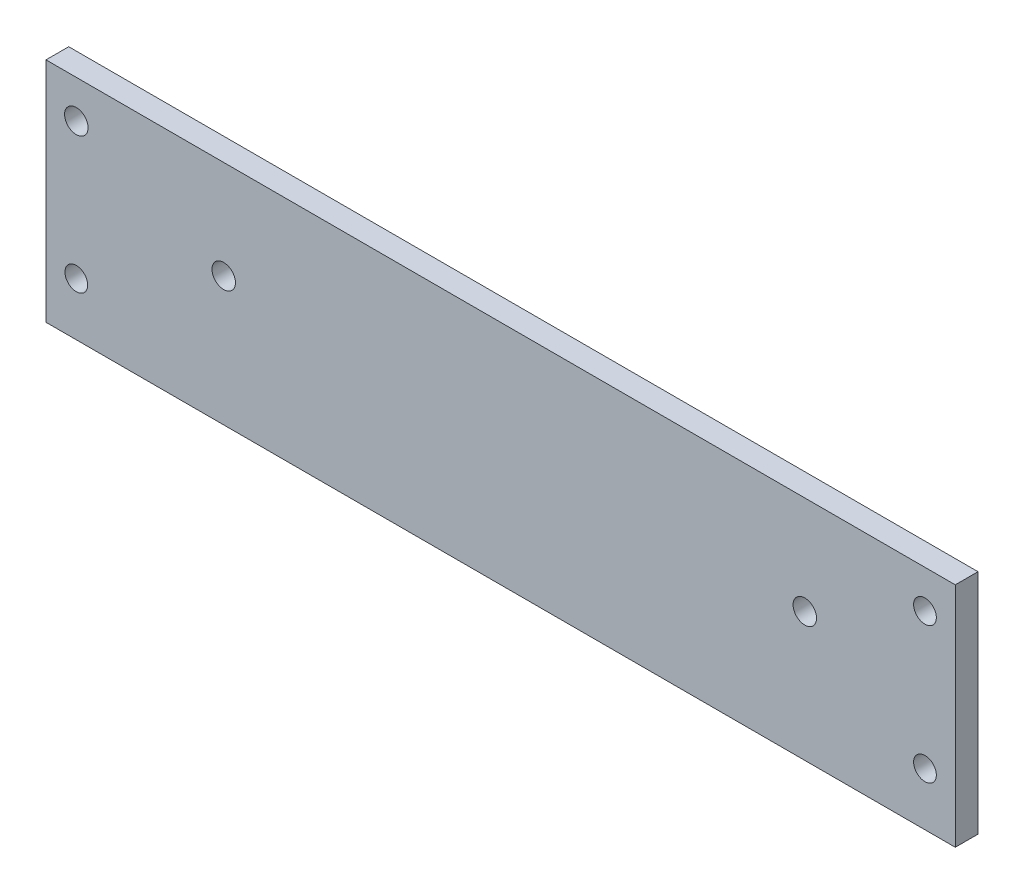
ISO-10303-21;
HEADER;
FILE_DESCRIPTION(('STEP AP214'),'2;1');
FILE_NAME('part.step','',(''),(''),'','','');
FILE_SCHEMA(('AUTOMOTIVE_DESIGN { 1 0 10303 214 1 1 1 1 }'));
ENDSEC;
DATA;
#1=APPLICATION_CONTEXT('core data for automotive mechanical design processes');
#2=APPLICATION_PROTOCOL_DEFINITION('international standard','automotive_design',2000,#1);
#3=PRODUCT_CONTEXT('',#1,'mechanical');
#4=PRODUCT('Part','Part','',(#3));
#5=PRODUCT_RELATED_PRODUCT_CATEGORY('part','',(#4));
#6=PRODUCT_DEFINITION_FORMATION('','',#4);
#7=PRODUCT_DEFINITION_CONTEXT('part definition',#1,'design');
#8=PRODUCT_DEFINITION('design','',#6,#7);
#9=PRODUCT_DEFINITION_SHAPE('','',#8);
#10=(LENGTH_UNIT() NAMED_UNIT(*) SI_UNIT(.MILLI.,.METRE.));
#11=(NAMED_UNIT(*) PLANE_ANGLE_UNIT() SI_UNIT($,.RADIAN.));
#12=(NAMED_UNIT(*) SI_UNIT($,.STERADIAN.) SOLID_ANGLE_UNIT());
#13=UNCERTAINTY_MEASURE_WITH_UNIT(LENGTH_MEASURE(1.E-05),#10,'distance_accuracy_value','');
#14=(GEOMETRIC_REPRESENTATION_CONTEXT(3) GLOBAL_UNCERTAINTY_ASSIGNED_CONTEXT((#13)) GLOBAL_UNIT_ASSIGNED_CONTEXT((#10,
#11,#12)) REPRESENTATION_CONTEXT('',''));
#15=CARTESIAN_POINT('',(0.,0.,0.));
#16=DIRECTION('',(0.,0.,1.));
#17=DIRECTION('',(1.,0.,0.));
#18=AXIS2_PLACEMENT_3D('',#15,#16,#17);
#19=CARTESIAN_POINT('',(-60.,-15.,3.));
#20=DIRECTION('',(1.,0.,0.));
#21=DIRECTION('',(0.,0.,-1.));
#22=AXIS2_PLACEMENT_3D('',#19,#20,#21);
#23=PLANE('',#22);
#24=DIRECTION('',(0.,-1.,0.));
#25=VECTOR('',#24,1.);
#26=CARTESIAN_POINT('',(-60.,-15.,0.));
#27=LINE('',#26,#25);
#28=CARTESIAN_POINT('',(-60.,15.,0.));
#29=VERTEX_POINT('',#28);
#30=CARTESIAN_POINT('',(-60.,-15.,0.));
#31=VERTEX_POINT('',#30);
#32=EDGE_CURVE('E113',#29,#31,#27,.T.);
#33=ORIENTED_EDGE('',*,*,#32,.T.);
#34=DIRECTION('',(0.,0.,-1.));
#35=VECTOR('',#34,1.);
#36=CARTESIAN_POINT('',(-60.,-15.,3.));
#37=LINE('',#36,#35);
#38=CARTESIAN_POINT('',(-60.,-15.,3.));
#39=VERTEX_POINT('',#38);
#40=EDGE_CURVE('E11',#39,#31,#37,.T.);
#41=ORIENTED_EDGE('',*,*,#40,.F.);
#42=DIRECTION('',(0.,-1.,0.));
#43=VECTOR('',#42,1.);
#44=CARTESIAN_POINT('',(-60.,-15.,3.));
#45=LINE('',#44,#43);
#46=CARTESIAN_POINT('',(-60.,15.,3.));
#47=VERTEX_POINT('',#46);
#48=EDGE_CURVE('E96',#47,#39,#45,.T.);
#49=ORIENTED_EDGE('',*,*,#48,.F.);
#50=DIRECTION('',(0.,0.,-1.));
#51=VECTOR('',#50,1.);
#52=CARTESIAN_POINT('',(-60.,15.,3.));
#53=LINE('',#52,#51);
#54=EDGE_CURVE('E109',#47,#29,#53,.T.);
#55=ORIENTED_EDGE('',*,*,#54,.T.);
#56=EDGE_LOOP('',(#33,#41,#49,#55));
#57=FACE_BOUND('',#56,.T.);
#58=ADVANCED_FACE('F42',(#57),#23,.F.);
#59=CARTESIAN_POINT('',(60.,-15.,3.));
#60=DIRECTION('',(0.,1.,0.));
#61=DIRECTION('',(-1.,0.,0.));
#62=AXIS2_PLACEMENT_3D('',#59,#60,#61);
#63=PLANE('',#62);
#64=DIRECTION('',(1.,0.,0.));
#65=VECTOR('',#64,1.);
#66=CARTESIAN_POINT('',(60.,-15.,0.));
#67=LINE('',#66,#65);
#68=CARTESIAN_POINT('',(60.,-15.,0.));
#69=VERTEX_POINT('',#68);
#70=EDGE_CURVE('E101',#31,#69,#67,.T.);
#71=ORIENTED_EDGE('',*,*,#70,.T.);
#72=DIRECTION('',(0.,0.,-1.));
#73=VECTOR('',#72,1.);
#74=CARTESIAN_POINT('',(60.,-15.,3.));
#75=LINE('',#74,#73);
#76=CARTESIAN_POINT('',(60.,-15.,3.));
#77=VERTEX_POINT('',#76);
#78=EDGE_CURVE('E52',#77,#69,#75,.T.);
#79=ORIENTED_EDGE('',*,*,#78,.F.);
#80=DIRECTION('',(1.,0.,0.));
#81=VECTOR('',#80,1.);
#82=CARTESIAN_POINT('',(60.,-15.,3.));
#83=LINE('',#82,#81);
#84=EDGE_CURVE('E91',#39,#77,#83,.T.);
#85=ORIENTED_EDGE('',*,*,#84,.F.);
#86=ORIENTED_EDGE('',*,*,#40,.T.);
#87=EDGE_LOOP('',(#71,#79,#85,#86));
#88=FACE_BOUND('',#87,.T.);
#89=ADVANCED_FACE('F100',(#88),#63,.F.);
#90=CARTESIAN_POINT('',(60.,-15.,3.));
#91=DIRECTION('',(-1.,0.,0.));
#92=DIRECTION('',(0.,0.,1.));
#93=AXIS2_PLACEMENT_3D('',#90,#91,#92);
#94=PLANE('',#93);
#95=DIRECTION('',(0.,1.,0.));
#96=VECTOR('',#95,1.);
#97=CARTESIAN_POINT('',(60.,-15.,0.));
#98=LINE('',#97,#96);
#99=CARTESIAN_POINT('',(60.,15.,0.));
#100=VERTEX_POINT('',#99);
#101=EDGE_CURVE('E78',#69,#100,#98,.T.);
#102=ORIENTED_EDGE('',*,*,#101,.T.);
#103=DIRECTION('',(0.,0.,-1.));
#104=VECTOR('',#103,1.);
#105=CARTESIAN_POINT('',(60.,15.,3.));
#106=LINE('',#105,#104);
#107=CARTESIAN_POINT('',(60.,15.,3.));
#108=VERTEX_POINT('',#107);
#109=EDGE_CURVE('E103',#108,#100,#106,.T.);
#110=ORIENTED_EDGE('',*,*,#109,.F.);
#111=DIRECTION('',(0.,1.,0.));
#112=VECTOR('',#111,1.);
#113=CARTESIAN_POINT('',(60.,-15.,3.));
#114=LINE('',#113,#112);
#115=EDGE_CURVE('E94',#77,#108,#114,.T.);
#116=ORIENTED_EDGE('',*,*,#115,.F.);
#117=ORIENTED_EDGE('',*,*,#78,.T.);
#118=EDGE_LOOP('',(#102,#110,#116,#117));
#119=FACE_BOUND('',#118,.T.);
#120=ADVANCED_FACE('F105',(#119),#94,.F.);
#121=CARTESIAN_POINT('',(60.,15.,3.));
#122=DIRECTION('',(0.,-1.,0.));
#123=DIRECTION('',(1.,0.,0.));
#124=AXIS2_PLACEMENT_3D('',#121,#122,#123);
#125=PLANE('',#124);
#126=DIRECTION('',(-1.,0.,0.));
#127=VECTOR('',#126,1.);
#128=CARTESIAN_POINT('',(60.,15.,0.));
#129=LINE('',#128,#127);
#130=EDGE_CURVE('E84',#100,#29,#129,.T.);
#131=ORIENTED_EDGE('',*,*,#130,.T.);
#132=ORIENTED_EDGE('',*,*,#54,.F.);
#133=DIRECTION('',(-1.,0.,0.));
#134=VECTOR('',#133,1.);
#135=CARTESIAN_POINT('',(60.,15.,3.));
#136=LINE('',#135,#134);
#137=EDGE_CURVE('E61',#108,#47,#136,.T.);
#138=ORIENTED_EDGE('',*,*,#137,.F.);
#139=ORIENTED_EDGE('',*,*,#109,.T.);
#140=EDGE_LOOP('',(#131,#132,#138,#139));
#141=FACE_BOUND('',#140,.T.);
#142=ADVANCED_FACE('F172',(#141),#125,.F.);
#143=CARTESIAN_POINT('',(0.,0.,3.));
#144=DIRECTION('',(0.,0.,1.));
#145=DIRECTION('',(1.,0.,0.));
#146=AXIS2_PLACEMENT_3D('',#143,#144,#145);
#147=PLANE('',#146);
#148=CARTESIAN_POINT('',(40.1462608836722,2.01999999999951,3.));
#149=DIRECTION('',(0.,0.,-1.));
#150=DIRECTION('',(-1.,0.,0.));
#151=AXIS2_PLACEMENT_3D('',#148,#149,#150);
#152=CIRCLE('',#151,1.55);
#153=CARTESIAN_POINT('',(38.5962608836722,2.01999999999951,3.));
#154=VERTEX_POINT('',#153);
#155=EDGE_CURVE('E144',#154,#154,#152,.T.);
#156=ORIENTED_EDGE('',*,*,#155,.T.);
#157=EDGE_LOOP('',(#156));
#158=FACE_BOUND('',#157,.T.);
#159=CARTESIAN_POINT('',(-36.5462608836722,2.01999999999946,3.));
#160=DIRECTION('',(0.,0.,-1.));
#161=DIRECTION('',(-1.,0.,0.));
#162=AXIS2_PLACEMENT_3D('',#159,#160,#161);
#163=CIRCLE('',#162,1.55);
#164=CARTESIAN_POINT('',(-38.0962608836722,2.01999999999946,3.));
#165=VERTEX_POINT('',#164);
#166=EDGE_CURVE('E147',#165,#165,#163,.T.);
#167=ORIENTED_EDGE('',*,*,#166,.T.);
#168=EDGE_LOOP('',(#167));
#169=FACE_BOUND('',#168,.T.);
#170=CARTESIAN_POINT('',(-56.,-7.99999999999999,3.));
#171=DIRECTION('',(0.,0.,1.));
#172=DIRECTION('',(1.,0.,0.));
#173=AXIS2_PLACEMENT_3D('',#170,#171,#172);
#174=CIRCLE('',#173,1.5);
#175=CARTESIAN_POINT('',(-54.5,-7.99999999999999,3.));
#176=VERTEX_POINT('',#175);
#177=EDGE_CURVE('E130',#176,#176,#174,.T.);
#178=ORIENTED_EDGE('',*,*,#177,.F.);
#179=EDGE_LOOP('',(#178));
#180=FACE_BOUND('',#179,.T.);
#181=CARTESIAN_POINT('',(56.,-7.99999999999998,3.));
#182=DIRECTION('',(0.,0.,1.));
#183=DIRECTION('',(1.,0.,0.));
#184=AXIS2_PLACEMENT_3D('',#181,#182,#183);
#185=CIRCLE('',#184,1.5);
#186=CARTESIAN_POINT('',(57.5,-7.99999999999998,3.));
#187=VERTEX_POINT('',#186);
#188=EDGE_CURVE('E138',#187,#187,#185,.T.);
#189=ORIENTED_EDGE('',*,*,#188,.F.);
#190=EDGE_LOOP('',(#189));
#191=FACE_BOUND('',#190,.T.);
#192=CARTESIAN_POINT('',(56.,10.,3.));
#193=DIRECTION('',(0.,0.,1.));
#194=DIRECTION('',(1.,0.,0.));
#195=AXIS2_PLACEMENT_3D('',#192,#193,#194);
#196=CIRCLE('',#195,1.5);
#197=CARTESIAN_POINT('',(57.5,10.,3.));
#198=VERTEX_POINT('',#197);
#199=EDGE_CURVE('E117',#198,#198,#196,.T.);
#200=ORIENTED_EDGE('',*,*,#199,.F.);
#201=EDGE_LOOP('',(#200));
#202=FACE_BOUND('',#201,.T.);
#203=CARTESIAN_POINT('',(-56.,10.,3.));
#204=DIRECTION('',(0.,0.,1.));
#205=DIRECTION('',(1.,0.,0.));
#206=AXIS2_PLACEMENT_3D('',#203,#204,#205);
#207=CIRCLE('',#206,1.54999999999999);
#208=CARTESIAN_POINT('',(-54.45,10.,3.));
#209=VERTEX_POINT('',#208);
#210=EDGE_CURVE('E154',#209,#209,#207,.T.);
#211=ORIENTED_EDGE('',*,*,#210,.F.);
#212=EDGE_LOOP('',(#211));
#213=FACE_BOUND('',#212,.T.);
#214=ORIENTED_EDGE('',*,*,#48,.T.);
#215=ORIENTED_EDGE('',*,*,#84,.T.);
#216=ORIENTED_EDGE('',*,*,#115,.T.);
#217=ORIENTED_EDGE('',*,*,#137,.T.);
#218=EDGE_LOOP('',(#214,#215,#216,#217));
#219=FACE_BOUND('',#218,.T.);
#220=ADVANCED_FACE('F92',(#158,#169,#180,#191,#202,#213,#219),#147,.T.);
#221=CARTESIAN_POINT('',(0.,0.,0.));
#222=DIRECTION('',(0.,0.,1.));
#223=DIRECTION('',(1.,0.,0.));
#224=AXIS2_PLACEMENT_3D('',#221,#222,#223);
#225=PLANE('',#224);
#226=CARTESIAN_POINT('',(40.1462608836722,2.01999999999951,0.));
#227=DIRECTION('',(0.,0.,-1.));
#228=DIRECTION('',(-1.,0.,0.));
#229=AXIS2_PLACEMENT_3D('',#226,#227,#228);
#230=CIRCLE('',#229,1.55);
#231=CARTESIAN_POINT('',(38.5962608836722,2.01999999999951,0.));
#232=VERTEX_POINT('',#231);
#233=EDGE_CURVE('E313',#232,#232,#230,.T.);
#234=ORIENTED_EDGE('',*,*,#233,.F.);
#235=EDGE_LOOP('',(#234));
#236=FACE_BOUND('',#235,.T.);
#237=CARTESIAN_POINT('',(-36.5462608836722,2.01999999999946,0.));
#238=DIRECTION('',(0.,0.,-1.));
#239=DIRECTION('',(-1.,0.,0.));
#240=AXIS2_PLACEMENT_3D('',#237,#238,#239);
#241=CIRCLE('',#240,1.55);
#242=CARTESIAN_POINT('',(-38.0962608836722,2.01999999999946,0.));
#243=VERTEX_POINT('',#242);
#244=EDGE_CURVE('E315',#243,#243,#241,.T.);
#245=ORIENTED_EDGE('',*,*,#244,.F.);
#246=EDGE_LOOP('',(#245));
#247=FACE_BOUND('',#246,.T.);
#248=CARTESIAN_POINT('',(-56.,-7.99999999999999,0.));
#249=DIRECTION('',(0.,0.,1.));
#250=DIRECTION('',(1.,0.,0.));
#251=AXIS2_PLACEMENT_3D('',#248,#249,#250);
#252=CIRCLE('',#251,1.5);
#253=CARTESIAN_POINT('',(-54.5,-7.99999999999999,0.));
#254=VERTEX_POINT('',#253);
#255=EDGE_CURVE('E45',#254,#254,#252,.T.);
#256=ORIENTED_EDGE('',*,*,#255,.T.);
#257=EDGE_LOOP('',(#256));
#258=FACE_BOUND('',#257,.T.);
#259=CARTESIAN_POINT('',(56.,-7.99999999999998,0.));
#260=DIRECTION('',(0.,0.,1.));
#261=DIRECTION('',(1.,0.,0.));
#262=AXIS2_PLACEMENT_3D('',#259,#260,#261);
#263=CIRCLE('',#262,1.5);
#264=CARTESIAN_POINT('',(57.5,-7.99999999999998,0.));
#265=VERTEX_POINT('',#264);
#266=EDGE_CURVE('E127',#265,#265,#263,.T.);
#267=ORIENTED_EDGE('',*,*,#266,.T.);
#268=EDGE_LOOP('',(#267));
#269=FACE_BOUND('',#268,.T.);
#270=CARTESIAN_POINT('',(56.,10.,0.));
#271=DIRECTION('',(0.,0.,-1.));
#272=DIRECTION('',(-1.,0.,0.));
#273=AXIS2_PLACEMENT_3D('',#270,#271,#272);
#274=CIRCLE('',#273,1.5);
#275=CARTESIAN_POINT('',(54.5,10.,0.));
#276=VERTEX_POINT('',#275);
#277=EDGE_CURVE('E150',#276,#276,#274,.T.);
#278=ORIENTED_EDGE('',*,*,#277,.F.);
#279=EDGE_LOOP('',(#278));
#280=FACE_BOUND('',#279,.T.);
#281=CARTESIAN_POINT('',(-56.,10.,0.));
#282=DIRECTION('',(0.,0.,-1.));
#283=DIRECTION('',(-1.,0.,0.));
#284=AXIS2_PLACEMENT_3D('',#281,#282,#283);
#285=CIRCLE('',#284,1.54999999999999);
#286=CARTESIAN_POINT('',(-57.55,10.,0.));
#287=VERTEX_POINT('',#286);
#288=EDGE_CURVE('E136',#287,#287,#285,.T.);
#289=ORIENTED_EDGE('',*,*,#288,.F.);
#290=EDGE_LOOP('',(#289));
#291=FACE_BOUND('',#290,.T.);
#292=ORIENTED_EDGE('',*,*,#32,.F.);
#293=ORIENTED_EDGE('',*,*,#130,.F.);
#294=ORIENTED_EDGE('',*,*,#101,.F.);
#295=ORIENTED_EDGE('',*,*,#70,.F.);
#296=EDGE_LOOP('',(#292,#293,#294,#295));
#297=FACE_BOUND('',#296,.T.);
#298=ADVANCED_FACE('F171',(#236,#247,#258,#269,#280,#291,#297),#225,.F.);
#299=CARTESIAN_POINT('',(-56.,10.,10.));
#300=DIRECTION('',(0.,0.,-1.));
#301=DIRECTION('',(-1.,0.,0.));
#302=AXIS2_PLACEMENT_3D('',#299,#300,#301);
#303=CYLINDRICAL_SURFACE('',#302,1.54999999999999);
#304=ORIENTED_EDGE('',*,*,#210,.T.);
#305=EDGE_LOOP('',(#304));
#306=FACE_BOUND('',#305,.T.);
#307=ORIENTED_EDGE('',*,*,#288,.T.);
#308=EDGE_LOOP('',(#307));
#309=FACE_BOUND('',#308,.T.);
#310=ADVANCED_FACE('F177',(#306,#309),#303,.F.);
#311=CARTESIAN_POINT('',(56.,10.,10.));
#312=DIRECTION('',(0.,0.,-1.));
#313=DIRECTION('',(-1.,0.,0.));
#314=AXIS2_PLACEMENT_3D('',#311,#312,#313);
#315=CYLINDRICAL_SURFACE('',#314,1.5);
#316=ORIENTED_EDGE('',*,*,#199,.T.);
#317=EDGE_LOOP('',(#316));
#318=FACE_BOUND('',#317,.T.);
#319=ORIENTED_EDGE('',*,*,#277,.T.);
#320=EDGE_LOOP('',(#319));
#321=FACE_BOUND('',#320,.T.);
#322=ADVANCED_FACE('F166',(#318,#321),#315,.F.);
#323=CARTESIAN_POINT('',(56.,-7.99999999999998,-7.));
#324=DIRECTION('',(0.,0.,1.));
#325=DIRECTION('',(1.,0.,0.));
#326=AXIS2_PLACEMENT_3D('',#323,#324,#325);
#327=CYLINDRICAL_SURFACE('',#326,1.5);
#328=ORIENTED_EDGE('',*,*,#188,.T.);
#329=EDGE_LOOP('',(#328));
#330=FACE_BOUND('',#329,.T.);
#331=ORIENTED_EDGE('',*,*,#266,.F.);
#332=EDGE_LOOP('',(#331));
#333=FACE_BOUND('',#332,.T.);
#334=ADVANCED_FACE('F229',(#330,#333),#327,.F.);
#335=CARTESIAN_POINT('',(-56.,-7.99999999999999,-7.));
#336=DIRECTION('',(0.,0.,1.));
#337=DIRECTION('',(1.,0.,0.));
#338=AXIS2_PLACEMENT_3D('',#335,#336,#337);
#339=CYLINDRICAL_SURFACE('',#338,1.5);
#340=ORIENTED_EDGE('',*,*,#177,.T.);
#341=EDGE_LOOP('',(#340));
#342=FACE_BOUND('',#341,.T.);
#343=ORIENTED_EDGE('',*,*,#255,.F.);
#344=EDGE_LOOP('',(#343));
#345=FACE_BOUND('',#344,.T.);
#346=ADVANCED_FACE('F239',(#342,#345),#339,.F.);
#347=CARTESIAN_POINT('',(-36.5462608836722,2.01999999999946,3.));
#348=DIRECTION('',(0.,0.,-1.));
#349=DIRECTION('',(-1.,0.,0.));
#350=AXIS2_PLACEMENT_3D('',#347,#348,#349);
#351=CYLINDRICAL_SURFACE('',#350,1.55);
#352=ORIENTED_EDGE('',*,*,#166,.F.);
#353=EDGE_LOOP('',(#352));
#354=FACE_BOUND('',#353,.T.);
#355=ORIENTED_EDGE('',*,*,#244,.T.);
#356=EDGE_LOOP('',(#355));
#357=FACE_BOUND('',#356,.T.);
#358=ADVANCED_FACE('F250',(#354,#357),#351,.F.);
#359=CARTESIAN_POINT('',(40.1462608836722,2.01999999999951,3.));
#360=DIRECTION('',(0.,0.,-1.));
#361=DIRECTION('',(-1.,0.,0.));
#362=AXIS2_PLACEMENT_3D('',#359,#360,#361);
#363=CYLINDRICAL_SURFACE('',#362,1.55);
#364=ORIENTED_EDGE('',*,*,#155,.F.);
#365=EDGE_LOOP('',(#364));
#366=FACE_BOUND('',#365,.T.);
#367=ORIENTED_EDGE('',*,*,#233,.T.);
#368=EDGE_LOOP('',(#367));
#369=FACE_BOUND('',#368,.T.);
#370=ADVANCED_FACE('F272',(#366,#369),#363,.F.);
#371=CLOSED_SHELL('',(#58,#89,#120,#142,#220,#298,#310,#322,#334,#346,#358,#370));
#372=MANIFOLD_SOLID_BREP('B2',#371);
#373=ADVANCED_BREP_SHAPE_REPRESENTATION('',(#18,#372),#14);
#374=SHAPE_DEFINITION_REPRESENTATION(#9,#373);
ENDSEC;
END-ISO-10303-21;
